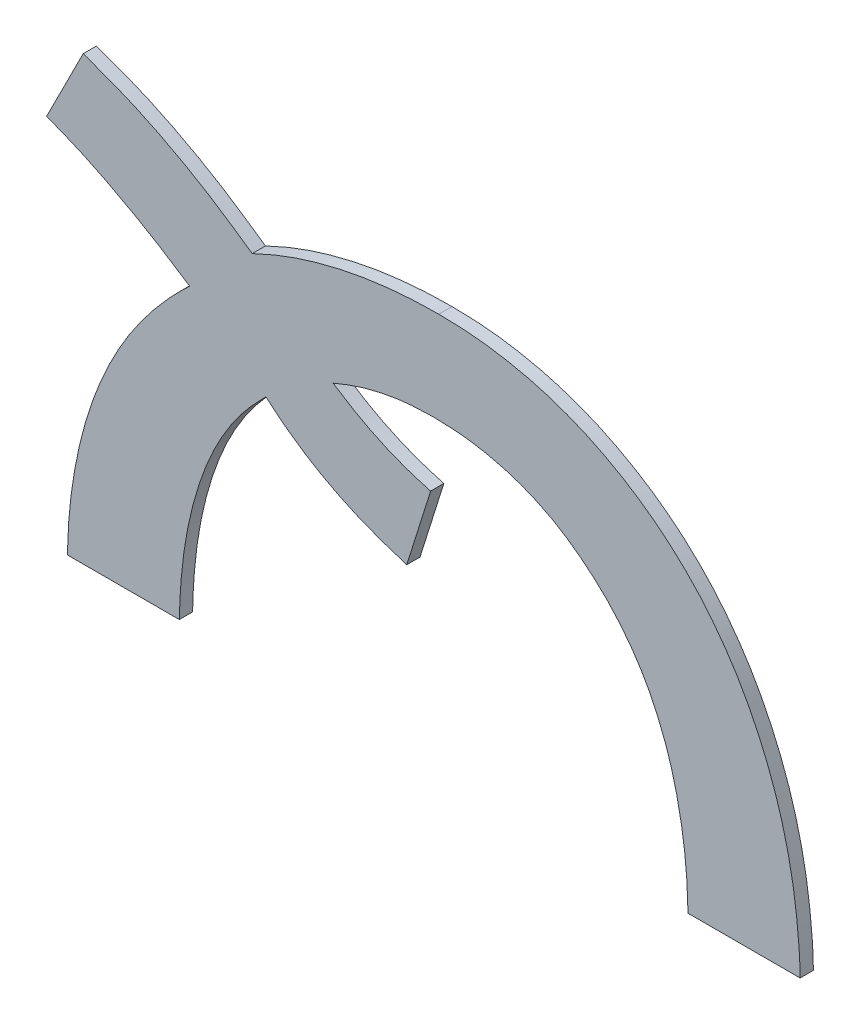
ISO-10303-21;
HEADER;
FILE_DESCRIPTION(('STEP AP214'),'2;1');
FILE_NAME('part.step','',(''),(''),'','','');
FILE_SCHEMA(('AUTOMOTIVE_DESIGN { 1 0 10303 214 1 1 1 1 }'));
ENDSEC;
DATA;
#1=APPLICATION_CONTEXT('core data for automotive mechanical design processes');
#2=APPLICATION_PROTOCOL_DEFINITION('international standard','automotive_design',2000,#1);
#3=PRODUCT_CONTEXT('',#1,'mechanical');
#4=PRODUCT('Part','Part','',(#3));
#5=PRODUCT_RELATED_PRODUCT_CATEGORY('part','',(#4));
#6=PRODUCT_DEFINITION_FORMATION('','',#4);
#7=PRODUCT_DEFINITION_CONTEXT('part definition',#1,'design');
#8=PRODUCT_DEFINITION('design','',#6,#7);
#9=PRODUCT_DEFINITION_SHAPE('','',#8);
#10=(LENGTH_UNIT() NAMED_UNIT(*) SI_UNIT(.MILLI.,.METRE.));
#11=(NAMED_UNIT(*) PLANE_ANGLE_UNIT() SI_UNIT($,.RADIAN.));
#12=(NAMED_UNIT(*) SI_UNIT($,.STERADIAN.) SOLID_ANGLE_UNIT());
#13=UNCERTAINTY_MEASURE_WITH_UNIT(LENGTH_MEASURE(1.E-05),#10,'distance_accuracy_value','');
#14=(GEOMETRIC_REPRESENTATION_CONTEXT(3) GLOBAL_UNCERTAINTY_ASSIGNED_CONTEXT((#13)) GLOBAL_UNIT_ASSIGNED_CONTEXT((#10,
#11,#12)) REPRESENTATION_CONTEXT('',''));
#15=CARTESIAN_POINT('',(0.,0.,0.));
#16=DIRECTION('',(0.,0.,1.));
#17=DIRECTION('',(1.,0.,0.));
#18=AXIS2_PLACEMENT_3D('',#15,#16,#17);
#19=CARTESIAN_POINT('',(-12.3982386079212,6.27826392564542,0.5));
#20=DIRECTION('',(0.,0.,1.));
#21=DIRECTION('',(1.,0.,0.));
#22=AXIS2_PLACEMENT_3D('',#19,#20,#21);
#23=PLANE('',#22);
#24=CARTESIAN_POINT('',(0.576923076923074,15.3846153846154,0.5));
#25=CARTESIAN_POINT('',(0.897619341624967,15.3787984604875,0.5));
#26=CARTESIAN_POINT('',(1.53228331754493,15.3672866575733,0.5));
#27=CARTESIAN_POINT('',(2.47464645125807,15.2766283145306,0.5));
#28=CARTESIAN_POINT('',(3.39276241348074,15.1169792641043,0.5));
#29=CARTESIAN_POINT('',(4.29266032368816,14.9113478929094,0.5));
#30=CARTESIAN_POINT('',(5.16350841743705,14.6295595206929,0.5));
#31=CARTESIAN_POINT('',(6.01619006759134,14.3024569764994,0.5));
#32=CARTESIAN_POINT('',(6.84083114128619,13.9005862613539,0.5));
#33=CARTESIAN_POINT('',(7.64330936840855,13.4474074551456,0.5));
#34=CARTESIAN_POINT('',(8.41087821578076,12.9377932302964,0.5));
#35=CARTESIAN_POINT('',(9.13697353297306,12.3764459160536,0.5));
#36=CARTESIAN_POINT('',(9.81513106542851,11.7610085525797,0.5));
#37=CARTESIAN_POINT('',(10.4546382387203,11.1026201644002,0.5));
#38=CARTESIAN_POINT('',(11.0378888073002,10.3870957987931,0.5));
#39=CARTESIAN_POINT('',(11.5817063578826,9.62748963764886,0.5));
#40=CARTESIAN_POINT('',(12.0801177436875,8.81640537319767,0.5));
#41=CARTESIAN_POINT('',(12.5279999518953,7.95734522134682,0.5));
#42=CARTESIAN_POINT('',(12.9314396675392,7.06317020682446,0.5));
#43=CARTESIAN_POINT('',(13.2788140744158,6.13726011642643,0.5));
#44=CARTESIAN_POINT('',(13.5748874813459,5.18438418310955,0.5));
#45=CARTESIAN_POINT('',(13.8148333799239,4.20289553652234,0.5));
#46=CARTESIAN_POINT('',(14.0012038848267,3.19352575648622,0.5));
#47=CARTESIAN_POINT('',(14.130269006995,2.15597744458412,0.5));
#48=CARTESIAN_POINT('',(14.2205910164886,1.09334364334748,0.5));
#49=CARTESIAN_POINT('',(14.2273545422517,0.374792695103607,0.5));
#50=CARTESIAN_POINT('',(14.2307692307692,0.0120192307692304,0.5));
#51=B_SPLINE_CURVE_WITH_KNOTS('',3,(#24,#25,#26,#27,#28,#29,#30,#31,#32,#33,#34,#35,#36,#37,#38,
#39,#40,#41,#42,#43,#44,#45,#46,#47,#48,#49,#50),.UNSPECIFIED.,.F.,.F.,(4,1,1,1,1,1,1,1,1,1,1,1,
1,1,1,1,1,1,1,1,1,1,1,1,4),(0.,0.0417232689446733,0.0825711387110152,0.123021249513785,
0.162914135863894,0.202563611799557,0.24201125109967,0.281647017573563,0.32179960719226,
0.36184800870174,0.401418590368862,0.44109547101707,0.480911651680141,0.520725272941832,
0.561083748663584,0.60238891117765,0.6444761293121,0.687057601964957,0.729949051165575,
0.773065612414117,0.816810983522217,0.861338270957762,0.906534131619744,0.95281206301071,1.),.UNSPECIFIED.);
#52=CARTESIAN_POINT('',(0.576923076923074,15.3846153846154,0.5));
#53=VERTEX_POINT('',#52);
#54=CARTESIAN_POINT('',(14.2249316228687,0.5,0.5));
#55=VERTEX_POINT('',#54);
#56=EDGE_CURVE('E277',#53,#55,#51,.T.);
#57=ORIENTED_EDGE('',*,*,#56,.T.);
#58=DIRECTION('',(-1.,0.,0.));
#59=VECTOR('',#58,1.);
#60=CARTESIAN_POINT('',(-12.3982386079212,0.5,0.5));
#61=LINE('',#60,#59);
#62=CARTESIAN_POINT('',(9.99087380576317,0.5,0.5));
#63=VERTEX_POINT('',#62);
#64=EDGE_CURVE('E158',#55,#63,#61,.T.);
#65=ORIENTED_EDGE('',*,*,#64,.T.);
#66=CARTESIAN_POINT('',(10.,0.,0.5));
#67=CARTESIAN_POINT('',(9.9922792013081,0.467014057872968,0.5));
#68=CARTESIAN_POINT('',(9.97730448483657,1.37280157856109,0.5));
#69=CARTESIAN_POINT('',(9.85158071000492,2.69117608092411,0.5));
#70=CARTESIAN_POINT('',(9.63384343863532,3.92365530492593,0.5));
#71=CARTESIAN_POINT('',(9.34554905740699,5.07886684818043,0.5));
#72=CARTESIAN_POINT('',(8.95708699602344,6.14518844517494,0.5));
#73=CARTESIAN_POINT('',(8.49707536101354,7.13419261451192,0.5));
#74=CARTESIAN_POINT('',(7.94070220651536,8.03447107253892,0.500000000000001));
#75=CARTESIAN_POINT('',(7.30253401757682,8.84588556284268,0.5));
#76=CARTESIAN_POINT('',(6.59977786799587,9.56752298930225,0.5));
#77=CARTESIAN_POINT('',(5.84390717476958,10.194167751821,0.5));
#78=CARTESIAN_POINT('',(5.04937942384997,10.7364560293608,0.5));
#79=CARTESIAN_POINT('',(4.19881378747112,11.1719859807892,0.5));
#80=CARTESIAN_POINT('',(3.30086595430551,11.508275036905,0.5));
#81=CARTESIAN_POINT('',(2.35785953735712,11.7481374579581,0.5));
#82=CARTESIAN_POINT('',(1.36893698318586,11.8972655077949,0.5));
#83=CARTESIAN_POINT('',(0.693646802548687,11.9143475825137,0.5));
#84=CARTESIAN_POINT('',(0.34855769230769,11.9230769230769,0.5));
#85=B_SPLINE_CURVE_WITH_KNOTS('',3,(#66,#67,#68,#69,#70,#71,#72,#73,#74,#75,#76,#77,#78,#79,#80,
#81,#82,#83,#84),.UNSPECIFIED.,.F.,.F.,(4,1,1,1,1,1,1,1,1,1,1,1,1,1,1,1,4),(0.,
0.0810326621300396,0.157165234939228,0.229518397457671,0.298064470604454,0.363492405304042,
0.426159072652892,0.487032782037051,0.546699482760247,0.604960279723965,0.661486145143537,
0.716828091605148,0.771554126409179,0.826887338001704,0.882870803772946,0.940144235369899,1.),.UNSPECIFIED.);
#86=CARTESIAN_POINT('',(0.34855769230769,11.9230769230769,0.5));
#87=VERTEX_POINT('',#86);
#88=EDGE_CURVE('E555',#63,#87,#85,.T.);
#89=ORIENTED_EDGE('',*,*,#88,.T.);
#90=CARTESIAN_POINT('',(0.34855769230769,11.9230769230769,0.5));
#91=CARTESIAN_POINT('',(0.0193452359396035,11.9148843529333,0.5));
#92=CARTESIAN_POINT('',(-0.630599722610887,11.8987102393498,0.5));
#93=CARTESIAN_POINT('',(-1.59000664115034,11.7376437849044,0.5));
#94=CARTESIAN_POINT('',(-2.52369149856271,11.5000166192497,0.5));
#95=CARTESIAN_POINT('',(-3.11736668310616,11.2570144009192,0.5));
#96=CARTESIAN_POINT('',(-3.41346153846154,11.1358173076923,0.5));
#97=B_SPLINE_CURVE_WITH_KNOTS('',3,(#90,#91,#92,#93,#94,#95,#96),.UNSPECIFIED.,.F.,.F.,(4,1,1,1,
4),(0.,0.254952441716652,0.503337741202005,0.752290236297546,1.),.UNSPECIFIED.);
#98=CARTESIAN_POINT('',(-3.41346153846154,11.1358173076923,0.5));
#99=VERTEX_POINT('',#98);
#100=EDGE_CURVE('E377',#87,#99,#97,.T.);
#101=ORIENTED_EDGE('',*,*,#100,.T.);
#102=CARTESIAN_POINT('',(-3.41346153846154,11.1358173076923,0.5));
#103=CARTESIAN_POINT('',(-3.12193255975835,10.9485047593671,0.5));
#104=CARTESIAN_POINT('',(-2.54231838442725,10.5760923538847,0.5));
#105=CARTESIAN_POINT('',(-1.62869956752675,10.1109285131715,0.5));
#106=CARTESIAN_POINT('',(-0.692808404415679,9.72462489088026,0.5));
#107=CARTESIAN_POINT('',(-0.0500473457026729,9.53944559915724,0.5));
#108=CARTESIAN_POINT('',(0.270432692307688,9.44711538461538,0.5));
#109=B_SPLINE_CURVE_WITH_KNOTS('',3,(#102,#103,#104,#105,#106,#107,#108),.UNSPECIFIED.,.F.,.F.,
(4,1,1,1,4),(0.,0.255212241850166,0.507409705039965,0.754394958573845,1.),.UNSPECIFIED.);
#110=CARTESIAN_POINT('',(0.270432692307688,9.44711538461538,0.5));
#111=VERTEX_POINT('',#110);
#112=EDGE_CURVE('E320',#99,#111,#109,.T.);
#113=ORIENTED_EDGE('',*,*,#112,.T.);
#114=DIRECTION('',(-0.300555941545493,-0.953764187837697,0.));
#115=VECTOR('',#114,1.);
#116=CARTESIAN_POINT('',(0.270432692307688,9.44711538461538,0.5));
#117=LINE('',#116,#115);
#118=CARTESIAN_POINT('',(-0.63100961538462,6.58653846153846,0.5));
#119=VERTEX_POINT('',#118);
#120=EDGE_CURVE('E306',#111,#119,#117,.T.);
#121=ORIENTED_EDGE('',*,*,#120,.T.);
#122=CARTESIAN_POINT('',(-0.63100961538462,6.58653846153846,0.5));
#123=CARTESIAN_POINT('',(-0.894319671134255,6.66803744267736,0.5));
#124=CARTESIAN_POINT('',(-1.41502985426516,6.82920618069991,0.5));
#125=CARTESIAN_POINT('',(-2.16813237873717,7.11271262365866,0.5));
#126=CARTESIAN_POINT('',(-2.89054022736661,7.41845518055138,0.5));
#127=CARTESIAN_POINT('',(-3.57092248636074,7.76113766295311,0.5));
#128=CARTESIAN_POINT('',(-4.22144770913973,8.12832644716513,0.5));
#129=CARTESIAN_POINT('',(-4.83039467529682,8.53225031230209,0.5));
#130=CARTESIAN_POINT('',(-5.41253203412093,8.95640226796856,0.5));
#131=CARTESIAN_POINT('',(-5.77133339907765,9.26822255770492,0.5));
#132=CARTESIAN_POINT('',(-5.94951923076923,9.42307692307692,0.5));
#133=B_SPLINE_CURVE_WITH_KNOTS('',3,(#122,#123,#124,#125,#126,#127,#128,#129,#130,#131,#132),
.UNSPECIFIED.,.F.,.F.,(4,1,1,1,1,1,1,1,4),(0.,0.136020898301321,0.268988841548293,
0.397000820882357,0.52302316466143,0.64480443078414,0.765468728430669,0.883528454003217,1.),.UNSPECIFIED.);
#134=CARTESIAN_POINT('',(-5.94951923076923,9.42307692307692,0.5));
#135=VERTEX_POINT('',#134);
#136=EDGE_CURVE('E301',#119,#135,#133,.T.);
#137=ORIENTED_EDGE('',*,*,#136,.T.);
#138=CARTESIAN_POINT('',(-5.94951923076923,9.42307692307692,0.5));
#139=CARTESIAN_POINT('',(-6.21339353106539,9.15102080343158,0.5));
#140=CARTESIAN_POINT('',(-6.74350021905969,8.60447736069422,0.5));
#141=CARTESIAN_POINT('',(-7.41029581302277,7.65841943132263,0.5));
#142=CARTESIAN_POINT('',(-7.97857306160017,6.62075798482048,0.5));
#143=CARTESIAN_POINT('',(-8.43343144317379,5.47860993740602,0.5));
#144=CARTESIAN_POINT('',(-8.79336837355103,4.24314577309855,0.5));
#145=CARTESIAN_POINT('',(-9.050810047283,2.90759580353337,0.5));
#146=CARTESIAN_POINT('',(-9.19861625487089,1.47369380087417,0.5));
#147=CARTESIAN_POINT('',(-9.21983868962944,0.485122001942624,0.5));
#148=CARTESIAN_POINT('',(-9.23076923076923,-0.0240384615384625,0.5));
#149=B_SPLINE_CURVE_WITH_KNOTS('',3,(#138,#139,#140,#141,#142,#143,#144,#145,#146,#147,#148),
.UNSPECIFIED.,.F.,.F.,(4,1,1,1,1,1,1,1,4),(0.,0.110462276308717,0.221911688165935,
0.336496788692268,0.455039818437065,0.579907747375789,0.71152433155377,0.851421611249838,1.),.UNSPECIFIED.);
#150=CARTESIAN_POINT('',(-9.21865830504153,0.499999999999652,0.5));
#151=VERTEX_POINT('',#150);
#152=EDGE_CURVE('E159',#135,#151,#149,.T.);
#153=ORIENTED_EDGE('',*,*,#152,.T.);
#154=CARTESIAN_POINT('',(-13.4480510897707,0.5,0.5));
#155=VERTEX_POINT('',#154);
#156=EDGE_CURVE('E76',#151,#155,#61,.T.);
#157=ORIENTED_EDGE('',*,*,#156,.T.);
#158=CARTESIAN_POINT('',(-13.4615384615385,-0.0661057692307697,0.5));
#159=CARTESIAN_POINT('',(-13.448447909796,0.529543360709466,0.5));
#160=CARTESIAN_POINT('',(-13.4228809732129,1.69289566476289,0.5));
#161=CARTESIAN_POINT('',(-13.2011750676567,3.39095602761635,0.5));
#162=CARTESIAN_POINT('',(-12.8438670998185,4.99791100235376,0.5));
#163=CARTESIAN_POINT('',(-12.4185715031614,6.26893732044281,0.5));
#164=CARTESIAN_POINT('',(-12.0103870575625,7.23531832842407,0.5));
#165=CARTESIAN_POINT('',(-11.6636298213357,7.92963536124989,0.5));
#166=CARTESIAN_POINT('',(-11.2876531477885,8.60481515554408,0.5));
#167=CARTESIAN_POINT('',(-10.8658731813786,9.25014548547508,0.5));
#168=CARTESIAN_POINT('',(-10.4128898755363,9.87593479592107,0.5));
#169=CARTESIAN_POINT('',(-9.91931982103668,10.4722777353817,0.5));
#170=CARTESIAN_POINT('',(-9.39779409454394,11.0558551419238,0.5));
#171=CARTESIAN_POINT('',(-9.01896871610589,11.4167479847997,0.5));
#172=CARTESIAN_POINT('',(-8.828125,11.5985576923077,0.5));
#173=B_SPLINE_CURVE_WITH_KNOTS('',3,(#158,#159,#160,#161,#162,#163,#164,#165,#166,#167,#168,
#169,#170,#171,#172),.UNSPECIFIED.,.F.,.F.,(4,1,1,1,1,1,1,1,1,1,1,1,4),(0.,0.138145050648068,
0.269808776487479,0.396539726104905,0.519552566820215,0.580151072298964,0.63980296260712,
0.699525420126483,0.759340032227184,0.818555811725106,0.878658619240928,0.938870938063966,1.),.UNSPECIFIED.);
#174=CARTESIAN_POINT('',(-8.828125,11.5985576923077,0.5));
#175=VERTEX_POINT('',#174);
#176=EDGE_CURVE('E157',#155,#175,#173,.T.);
#177=ORIENTED_EDGE('',*,*,#176,.T.);
#178=CARTESIAN_POINT('',(-8.828125,11.5985576923077,0.5));
#179=CARTESIAN_POINT('',(-9.30339084511521,11.9088027049189,0.5));
#180=CARTESIAN_POINT('',(-10.2196826900888,12.506941573767,0.5));
#181=CARTESIAN_POINT('',(-11.603756135955,13.2805049096162,0.5));
#182=CARTESIAN_POINT('',(-12.9223506421253,13.9425410548634,0.5));
#183=CARTESIAN_POINT('',(-13.8053507859795,14.287114038554,0.5));
#184=CARTESIAN_POINT('',(-14.2307692307692,14.453125,0.5));
#185=B_SPLINE_CURVE_WITH_KNOTS('',3,(#178,#179,#180,#181,#182,#183,#184),.UNSPECIFIED.,.F.,.F.,
(4,1,1,1,4),(0.,0.277956960753433,0.535888911458132,0.776397072105441,1.),.UNSPECIFIED.);
#186=CARTESIAN_POINT('',(-14.2307692307692,14.453125,0.5));
#187=VERTEX_POINT('',#186);
#188=EDGE_CURVE('E163',#175,#187,#185,.T.);
#189=ORIENTED_EDGE('',*,*,#188,.T.);
#190=DIRECTION('',(0.450343677813314,0.892855291664656,0.));
#191=VECTOR('',#190,1.);
#192=CARTESIAN_POINT('',(-14.2307692307692,14.453125,0.5));
#193=LINE('',#192,#191);
#194=CARTESIAN_POINT('',(-12.8485576923077,17.1935096153846,0.5));
#195=VERTEX_POINT('',#194);
#196=EDGE_CURVE('E167',#187,#195,#193,.T.);
#197=ORIENTED_EDGE('',*,*,#196,.T.);
#198=CARTESIAN_POINT('',(-12.8485576923077,17.1935096153846,0.5));
#199=CARTESIAN_POINT('',(-12.3120993784537,17.0000066791123,0.5));
#200=CARTESIAN_POINT('',(-11.2206986142658,16.6063334950711,0.5));
#201=CARTESIAN_POINT('',(-9.62170676964987,15.8375651898538,0.5));
#202=CARTESIAN_POINT('',(-8.02073337734736,14.9244452314316,0.5));
#203=CARTESIAN_POINT('',(-6.99201361843773,14.2108137520125,0.5));
#204=CARTESIAN_POINT('',(-6.46634615384616,13.8461538461538,0.5));
#205=B_SPLINE_CURVE_WITH_KNOTS('',3,(#198,#199,#200,#201,#202,#203,#204),.UNSPECIFIED.,.F.,.F.,
(4,1,1,1,4),(0.,0.236400155123091,0.48094568262331,0.734767447949169,1.),.UNSPECIFIED.);
#206=CARTESIAN_POINT('',(-6.46634615384616,13.8461538461538,0.5));
#207=VERTEX_POINT('',#206);
#208=EDGE_CURVE('E196',#195,#207,#205,.T.);
#209=ORIENTED_EDGE('',*,*,#208,.T.);
#210=CARTESIAN_POINT('',(-6.46634615384616,13.8461538461538,0.5));
#211=CARTESIAN_POINT('',(-6.19939511471727,13.9698084917005,0.5));
#212=CARTESIAN_POINT('',(-5.66430680122598,14.2176672599483,0.5));
#213=CARTESIAN_POINT('',(-4.83209778876263,14.5279171170542,0.5));
#214=CARTESIAN_POINT('',(-3.97926204408,14.7923295930873,0.5));
#215=CARTESIAN_POINT('',(-3.10637542461355,15.0087753843001,0.5));
#216=CARTESIAN_POINT('',(-2.21552557147388,15.1772174489932,0.5));
#217=CARTESIAN_POINT('',(-1.30470450159003,15.2970048763891,0.5));
#218=CARTESIAN_POINT('',(-0.371834038275706,15.3711748992426,0.5));
#219=CARTESIAN_POINT('',(0.258275605184074,15.380101292848,0.5));
#220=CARTESIAN_POINT('',(0.576923076923074,15.3846153846154,0.5));
#221=B_SPLINE_CURVE_WITH_KNOTS('',3,(#210,#211,#212,#213,#214,#215,#216,#217,#218,#219,#220),
.UNSPECIFIED.,.F.,.F.,(4,1,1,1,1,1,1,1,4),(0.,0.12135731050129,0.243253889619143,
0.36613298132967,0.489624940142382,0.614127982050897,0.740030729593687,0.868533117046174,1.),.UNSPECIFIED.);
#222=EDGE_CURVE('E201',#207,#53,#221,.T.);
#223=ORIENTED_EDGE('',*,*,#222,.T.);
#224=EDGE_LOOP('',(#57,#65,#89,#101,#113,#121,#137,#153,#157,#177,#189,#197,#209,#223));
#225=FACE_BOUND('',#224,.T.);
#226=ADVANCED_FACE('F39',(#225),#23,.F.);
#227=CARTESIAN_POINT('',(-12.3982386079212,6.27826392564542,1.));
#228=DIRECTION('',(0.,0.,1.));
#229=DIRECTION('',(1.,0.,0.));
#230=AXIS2_PLACEMENT_3D('',#227,#228,#229);
#231=PLANE('',#230);
#232=CARTESIAN_POINT('',(-13.4615384615385,-0.0661057692307697,1.));
#233=CARTESIAN_POINT('',(-13.448447909796,0.529543360709466,1.));
#234=CARTESIAN_POINT('',(-13.4228809732129,1.69289566476289,1.));
#235=CARTESIAN_POINT('',(-13.2011750676567,3.39095602761635,1.));
#236=CARTESIAN_POINT('',(-12.8438670998185,4.99791100235376,1.));
#237=CARTESIAN_POINT('',(-12.4185715031614,6.26893732044281,1.));
#238=CARTESIAN_POINT('',(-12.0103870575625,7.23531832842407,1.));
#239=CARTESIAN_POINT('',(-11.6636298213357,7.92963536124989,1.));
#240=CARTESIAN_POINT('',(-11.2876531477885,8.60481515554408,1.));
#241=CARTESIAN_POINT('',(-10.8658731813786,9.25014548547508,1.));
#242=CARTESIAN_POINT('',(-10.4128898755363,9.87593479592107,1.));
#243=CARTESIAN_POINT('',(-9.91931982103668,10.4722777353817,1.));
#244=CARTESIAN_POINT('',(-9.39779409454394,11.0558551419238,1.));
#245=CARTESIAN_POINT('',(-9.01896871610589,11.4167479847997,1.));
#246=CARTESIAN_POINT('',(-8.828125,11.5985576923077,1.));
#247=B_SPLINE_CURVE_WITH_KNOTS('',3,(#232,#233,#234,#235,#236,#237,#238,#239,#240,#241,#242,
#243,#244,#245,#246),.UNSPECIFIED.,.F.,.F.,(4,1,1,1,1,1,1,1,1,1,1,1,4),(0.,0.138145050648068,
0.269808776487479,0.396539726104905,0.519552566820215,0.580151072298964,0.63980296260712,
0.699525420126483,0.759340032227184,0.818555811725106,0.878658619240928,0.938870938063966,1.),.UNSPECIFIED.);
#248=CARTESIAN_POINT('',(-13.4480510897707,0.5,1.));
#249=VERTEX_POINT('',#248);
#250=CARTESIAN_POINT('',(-8.828125,11.5985576923077,1.));
#251=VERTEX_POINT('',#250);
#252=EDGE_CURVE('E152',#249,#251,#247,.T.);
#253=ORIENTED_EDGE('',*,*,#252,.F.);
#254=DIRECTION('',(1.,0.,0.));
#255=VECTOR('',#254,1.);
#256=CARTESIAN_POINT('',(-17.,0.5,1.));
#257=LINE('',#256,#255);
#258=CARTESIAN_POINT('',(-9.21865830504152,0.5,1.));
#259=VERTEX_POINT('',#258);
#260=EDGE_CURVE('E150',#249,#259,#257,.T.);
#261=ORIENTED_EDGE('',*,*,#260,.T.);
#262=CARTESIAN_POINT('',(-5.94951923076923,9.42307692307692,1.));
#263=CARTESIAN_POINT('',(-6.21339353106539,9.15102080343158,1.));
#264=CARTESIAN_POINT('',(-6.74350021905969,8.60447736069422,1.));
#265=CARTESIAN_POINT('',(-7.41029581302277,7.65841943132263,1.));
#266=CARTESIAN_POINT('',(-7.97857306160017,6.62075798482048,1.));
#267=CARTESIAN_POINT('',(-8.43343144317379,5.47860993740602,1.));
#268=CARTESIAN_POINT('',(-8.79336837355103,4.24314577309855,1.));
#269=CARTESIAN_POINT('',(-9.050810047283,2.90759580353337,1.));
#270=CARTESIAN_POINT('',(-9.19861625487089,1.47369380087417,1.));
#271=CARTESIAN_POINT('',(-9.21983868962944,0.485122001942624,1.));
#272=CARTESIAN_POINT('',(-9.23076923076923,-0.0240384615384625,1.));
#273=B_SPLINE_CURVE_WITH_KNOTS('',3,(#262,#263,#264,#265,#266,#267,#268,#269,#270,#271,#272),
.UNSPECIFIED.,.F.,.F.,(4,1,1,1,1,1,1,1,4),(0.,0.110462276308717,0.221911688165935,
0.336496788692268,0.455039818437065,0.579907747375789,0.71152433155377,0.851421611249838,1.),.UNSPECIFIED.);
#274=CARTESIAN_POINT('',(-5.94951923076923,9.42307692307692,1.));
#275=VERTEX_POINT('',#274);
#276=EDGE_CURVE('E325',#275,#259,#273,.T.);
#277=ORIENTED_EDGE('',*,*,#276,.F.);
#278=CARTESIAN_POINT('',(-0.63100961538462,6.58653846153846,1.));
#279=CARTESIAN_POINT('',(-0.894319671134255,6.66803744267736,1.));
#280=CARTESIAN_POINT('',(-1.41502985426516,6.82920618069991,1.));
#281=CARTESIAN_POINT('',(-2.16813237873717,7.11271262365866,1.));
#282=CARTESIAN_POINT('',(-2.89054022736661,7.41845518055138,1.));
#283=CARTESIAN_POINT('',(-3.57092248636074,7.76113766295311,1.));
#284=CARTESIAN_POINT('',(-4.22144770913973,8.12832644716513,1.));
#285=CARTESIAN_POINT('',(-4.83039467529682,8.53225031230209,1.));
#286=CARTESIAN_POINT('',(-5.41253203412093,8.95640226796856,1.));
#287=CARTESIAN_POINT('',(-5.77133339907765,9.26822255770492,1.));
#288=CARTESIAN_POINT('',(-5.94951923076923,9.42307692307692,1.));
#289=B_SPLINE_CURVE_WITH_KNOTS('',3,(#278,#279,#280,#281,#282,#283,#284,#285,#286,#287,#288),
.UNSPECIFIED.,.F.,.F.,(4,1,1,1,1,1,1,1,4),(0.,0.136020898301321,0.268988841548293,
0.397000820882357,0.52302316466143,0.64480443078414,0.765468728430669,0.883528454003217,1.),.UNSPECIFIED.);
#290=CARTESIAN_POINT('',(-0.63100961538462,6.58653846153846,1.));
#291=VERTEX_POINT('',#290);
#292=EDGE_CURVE('E47',#291,#275,#289,.T.);
#293=ORIENTED_EDGE('',*,*,#292,.F.);
#294=DIRECTION('',(-0.300555941545493,-0.953764187837697,0.));
#295=VECTOR('',#294,1.);
#296=CARTESIAN_POINT('',(0.270432692307688,9.44711538461538,1.));
#297=LINE('',#296,#295);
#298=CARTESIAN_POINT('',(0.270432692307688,9.44711538461538,1.));
#299=VERTEX_POINT('',#298);
#300=EDGE_CURVE('E339',#299,#291,#297,.T.);
#301=ORIENTED_EDGE('',*,*,#300,.F.);
#302=CARTESIAN_POINT('',(-3.41346153846154,11.1358173076923,1.));
#303=CARTESIAN_POINT('',(-3.12193255975835,10.9485047593671,1.));
#304=CARTESIAN_POINT('',(-2.54231838442725,10.5760923538847,1.));
#305=CARTESIAN_POINT('',(-1.62869956752675,10.1109285131715,1.));
#306=CARTESIAN_POINT('',(-0.692808404415679,9.72462489088026,1.));
#307=CARTESIAN_POINT('',(-0.0500473457026729,9.53944559915724,1.));
#308=CARTESIAN_POINT('',(0.270432692307688,9.44711538461538,1.));
#309=B_SPLINE_CURVE_WITH_KNOTS('',3,(#302,#303,#304,#305,#306,#307,#308),.UNSPECIFIED.,.F.,.F.,
(4,1,1,1,4),(0.,0.255212241850166,0.507409705039965,0.754394958573845,1.),.UNSPECIFIED.);
#310=CARTESIAN_POINT('',(-3.41346153846154,11.1358173076923,1.));
#311=VERTEX_POINT('',#310);
#312=EDGE_CURVE('E337',#311,#299,#309,.T.);
#313=ORIENTED_EDGE('',*,*,#312,.F.);
#314=CARTESIAN_POINT('',(0.34855769230769,11.9230769230769,1.));
#315=CARTESIAN_POINT('',(0.0193452359396035,11.9148843529333,1.));
#316=CARTESIAN_POINT('',(-0.630599722610887,11.8987102393498,1.));
#317=CARTESIAN_POINT('',(-1.59000664115034,11.7376437849044,1.));
#318=CARTESIAN_POINT('',(-2.52369149856271,11.5000166192497,1.));
#319=CARTESIAN_POINT('',(-3.11736668310616,11.2570144009192,1.));
#320=CARTESIAN_POINT('',(-3.41346153846154,11.1358173076923,1.));
#321=B_SPLINE_CURVE_WITH_KNOTS('',3,(#314,#315,#316,#317,#318,#319,#320),.UNSPECIFIED.,.F.,.F.,
(4,1,1,1,4),(0.,0.254952441716652,0.503337741202005,0.752290236297546,1.),.UNSPECIFIED.);
#322=CARTESIAN_POINT('',(0.34855769230769,11.9230769230769,1.));
#323=VERTEX_POINT('',#322);
#324=EDGE_CURVE('E324',#323,#311,#321,.T.);
#325=ORIENTED_EDGE('',*,*,#324,.F.);
#326=CARTESIAN_POINT('',(10.,0.,1.));
#327=CARTESIAN_POINT('',(9.9922792013081,0.467014057872968,1.));
#328=CARTESIAN_POINT('',(9.97730448483657,1.37280157856109,1.));
#329=CARTESIAN_POINT('',(9.85158071000492,2.69117608092411,1.));
#330=CARTESIAN_POINT('',(9.63384343863532,3.92365530492593,1.));
#331=CARTESIAN_POINT('',(9.34554905740699,5.07886684818043,1.));
#332=CARTESIAN_POINT('',(8.95708699602344,6.14518844517494,1.));
#333=CARTESIAN_POINT('',(8.49707536101354,7.13419261451192,1.));
#334=CARTESIAN_POINT('',(7.94070220651536,8.03447107253892,1.));
#335=CARTESIAN_POINT('',(7.30253401757682,8.84588556284268,1.));
#336=CARTESIAN_POINT('',(6.59977786799587,9.56752298930225,1.));
#337=CARTESIAN_POINT('',(5.84390717476958,10.194167751821,1.));
#338=CARTESIAN_POINT('',(5.04937942384997,10.7364560293608,1.));
#339=CARTESIAN_POINT('',(4.19881378747112,11.1719859807892,1.));
#340=CARTESIAN_POINT('',(3.30086595430551,11.508275036905,1.));
#341=CARTESIAN_POINT('',(2.35785953735712,11.7481374579581,1.));
#342=CARTESIAN_POINT('',(1.36893698318586,11.8972655077949,1.));
#343=CARTESIAN_POINT('',(0.693646802548687,11.9143475825137,1.));
#344=CARTESIAN_POINT('',(0.34855769230769,11.9230769230769,1.));
#345=B_SPLINE_CURVE_WITH_KNOTS('',3,(#326,#327,#328,#329,#330,#331,#332,#333,#334,#335,#336,
#337,#338,#339,#340,#341,#342,#343,#344),.UNSPECIFIED.,.F.,.F.,(4,1,1,1,1,1,1,1,1,1,1,1,1,1,1,1,
4),(0.,0.0810326621300396,0.157165234939228,0.229518397457671,0.298064470604454,
0.363492405304042,0.426159072652892,0.487032782037051,0.546699482760247,0.604960279723965,
0.661486145143537,0.716828091605148,0.771554126409179,0.826887338001704,0.882870803772946,
0.940144235369899,1.),.UNSPECIFIED.);
#346=CARTESIAN_POINT('',(9.99087380576317,0.499999999999684,1.));
#347=VERTEX_POINT('',#346);
#348=EDGE_CURVE('E245',#347,#323,#345,.T.);
#349=ORIENTED_EDGE('',*,*,#348,.F.);
#350=CARTESIAN_POINT('',(14.2249316228687,0.5,1.));
#351=VERTEX_POINT('',#350);
#352=EDGE_CURVE('E43',#347,#351,#257,.T.);
#353=ORIENTED_EDGE('',*,*,#352,.T.);
#354=CARTESIAN_POINT('',(0.576923076923074,15.3846153846154,1.));
#355=CARTESIAN_POINT('',(0.897619341624967,15.3787984604875,1.));
#356=CARTESIAN_POINT('',(1.53228331754493,15.3672866575733,1.));
#357=CARTESIAN_POINT('',(2.47464645125807,15.2766283145306,1.));
#358=CARTESIAN_POINT('',(3.39276241348074,15.1169792641043,1.));
#359=CARTESIAN_POINT('',(4.29266032368816,14.9113478929094,1.));
#360=CARTESIAN_POINT('',(5.16350841743705,14.6295595206929,1.));
#361=CARTESIAN_POINT('',(6.01619006759134,14.3024569764994,1.));
#362=CARTESIAN_POINT('',(6.84083114128619,13.9005862613539,1.));
#363=CARTESIAN_POINT('',(7.64330936840855,13.4474074551456,1.));
#364=CARTESIAN_POINT('',(8.41087821578076,12.9377932302964,1.));
#365=CARTESIAN_POINT('',(9.13697353297306,12.3764459160536,1.));
#366=CARTESIAN_POINT('',(9.81513106542851,11.7610085525797,1.));
#367=CARTESIAN_POINT('',(10.4546382387203,11.1026201644002,1.));
#368=CARTESIAN_POINT('',(11.0378888073002,10.3870957987931,1.));
#369=CARTESIAN_POINT('',(11.5817063578826,9.62748963764886,1.));
#370=CARTESIAN_POINT('',(12.0801177436875,8.81640537319767,1.));
#371=CARTESIAN_POINT('',(12.5279999518953,7.95734522134682,1.));
#372=CARTESIAN_POINT('',(12.9314396675392,7.06317020682446,1.));
#373=CARTESIAN_POINT('',(13.2788140744158,6.13726011642643,1.));
#374=CARTESIAN_POINT('',(13.5748874813459,5.18438418310955,1.));
#375=CARTESIAN_POINT('',(13.8148333799239,4.20289553652234,1.));
#376=CARTESIAN_POINT('',(14.0012038848267,3.19352575648622,1.));
#377=CARTESIAN_POINT('',(14.130269006995,2.15597744458412,1.));
#378=CARTESIAN_POINT('',(14.2205910164886,1.09334364334748,1.));
#379=CARTESIAN_POINT('',(14.2273545422517,0.374792695103607,1.));
#380=CARTESIAN_POINT('',(14.2307692307692,0.0120192307692304,1.));
#381=B_SPLINE_CURVE_WITH_KNOTS('',3,(#354,#355,#356,#357,#358,#359,#360,#361,#362,#363,#364,
#365,#366,#367,#368,#369,#370,#371,#372,#373,#374,#375,#376,#377,#378,#379,#380),.UNSPECIFIED.,
.F.,.F.,(4,1,1,1,1,1,1,1,1,1,1,1,1,1,1,1,1,1,1,1,1,1,1,1,4),(0.,0.0417232689446733,
0.0825711387110152,0.123021249513785,0.162914135863894,0.202563611799557,0.24201125109967,
0.281647017573563,0.32179960719226,0.36184800870174,0.401418590368862,0.44109547101707,
0.480911651680141,0.520725272941832,0.561083748663584,0.60238891117765,0.6444761293121,
0.687057601964957,0.729949051165575,0.773065612414117,0.816810983522217,0.861338270957762,
0.906534131619744,0.95281206301071,1.),.UNSPECIFIED.);
#382=CARTESIAN_POINT('',(0.576923076923074,15.3846153846154,1.));
#383=VERTEX_POINT('',#382);
#384=EDGE_CURVE('E229',#383,#351,#381,.T.);
#385=ORIENTED_EDGE('',*,*,#384,.F.);
#386=CARTESIAN_POINT('',(-6.46634615384616,13.8461538461538,1.));
#387=CARTESIAN_POINT('',(-6.19939511471727,13.9698084917005,1.));
#388=CARTESIAN_POINT('',(-5.66430680122598,14.2176672599483,1.));
#389=CARTESIAN_POINT('',(-4.83209778876263,14.5279171170542,1.));
#390=CARTESIAN_POINT('',(-3.97926204408,14.7923295930873,1.));
#391=CARTESIAN_POINT('',(-3.10637542461355,15.0087753843001,1.));
#392=CARTESIAN_POINT('',(-2.21552557147388,15.1772174489932,1.));
#393=CARTESIAN_POINT('',(-1.30470450159003,15.2970048763891,1.));
#394=CARTESIAN_POINT('',(-0.371834038275706,15.3711748992426,1.));
#395=CARTESIAN_POINT('',(0.258275605184074,15.380101292848,1.));
#396=CARTESIAN_POINT('',(0.576923076923074,15.3846153846154,1.));
#397=B_SPLINE_CURVE_WITH_KNOTS('',3,(#386,#387,#388,#389,#390,#391,#392,#393,#394,#395,#396),
.UNSPECIFIED.,.F.,.F.,(4,1,1,1,1,1,1,1,4),(0.,0.12135731050129,0.243253889619143,
0.36613298132967,0.489624940142382,0.614127982050897,0.740030729593687,0.868533117046174,1.),.UNSPECIFIED.);
#398=CARTESIAN_POINT('',(-6.46634615384616,13.8461538461538,1.));
#399=VERTEX_POINT('',#398);
#400=EDGE_CURVE('E225',#399,#383,#397,.T.);
#401=ORIENTED_EDGE('',*,*,#400,.F.);
#402=CARTESIAN_POINT('',(-12.8485576923077,17.1935096153846,1.));
#403=CARTESIAN_POINT('',(-12.3120993784537,17.0000066791123,1.));
#404=CARTESIAN_POINT('',(-11.2206986142658,16.6063334950711,1.));
#405=CARTESIAN_POINT('',(-9.62170676964987,15.8375651898538,1.));
#406=CARTESIAN_POINT('',(-8.02073337734736,14.9244452314316,1.));
#407=CARTESIAN_POINT('',(-6.99201361843773,14.2108137520125,1.));
#408=CARTESIAN_POINT('',(-6.46634615384616,13.8461538461538,1.));
#409=B_SPLINE_CURVE_WITH_KNOTS('',3,(#402,#403,#404,#405,#406,#407,#408),.UNSPECIFIED.,.F.,.F.,
(4,1,1,1,4),(0.,0.236400155123091,0.48094568262331,0.734767447949169,1.),.UNSPECIFIED.);
#410=CARTESIAN_POINT('',(-12.8485576923077,17.1935096153846,1.));
#411=VERTEX_POINT('',#410);
#412=EDGE_CURVE('E223',#411,#399,#409,.T.);
#413=ORIENTED_EDGE('',*,*,#412,.F.);
#414=DIRECTION('',(0.450343677813314,0.892855291664656,0.));
#415=VECTOR('',#414,1.);
#416=CARTESIAN_POINT('',(-14.2307692307692,14.453125,1.));
#417=LINE('',#416,#415);
#418=CARTESIAN_POINT('',(-14.2307692307692,14.453125,1.));
#419=VERTEX_POINT('',#418);
#420=EDGE_CURVE('E217',#419,#411,#417,.T.);
#421=ORIENTED_EDGE('',*,*,#420,.F.);
#422=CARTESIAN_POINT('',(-8.828125,11.5985576923077,1.));
#423=CARTESIAN_POINT('',(-9.30339084511521,11.9088027049189,1.));
#424=CARTESIAN_POINT('',(-10.2196826900888,12.506941573767,1.));
#425=CARTESIAN_POINT('',(-11.603756135955,13.2805049096162,1.));
#426=CARTESIAN_POINT('',(-12.9223506421253,13.9425410548634,1.));
#427=CARTESIAN_POINT('',(-13.8053507859795,14.287114038554,1.));
#428=CARTESIAN_POINT('',(-14.2307692307692,14.453125,1.));
#429=B_SPLINE_CURVE_WITH_KNOTS('',3,(#422,#423,#424,#425,#426,#427,#428),.UNSPECIFIED.,.F.,.F.,
(4,1,1,1,4),(0.,0.277956960753433,0.535888911458132,0.776397072105441,1.),.UNSPECIFIED.);
#430=EDGE_CURVE('E267',#251,#419,#429,.T.);
#431=ORIENTED_EDGE('',*,*,#430,.F.);
#432=EDGE_LOOP('',(#253,#261,#277,#293,#301,#313,#325,#349,#353,#385,#401,#413,#421,#431));
#433=FACE_BOUND('',#432,.T.);
#434=ADVANCED_FACE('F41',(#433),#231,.T.);
#435=DIRECTION('',(0.,0.,1.));
#436=VECTOR('',#435,1.);
#437=SURFACE_OF_LINEAR_EXTRUSION('',#173,#436);
#438=ORIENTED_EDGE('',*,*,#176,.F.);
#439=DIRECTION('',(0.,0.,1.));
#440=VECTOR('',#439,1.);
#441=CARTESIAN_POINT('',(-13.4480510895033,0.5,0.5));
#442=LINE('',#441,#440);
#443=EDGE_CURVE('E144',#155,#249,#442,.T.);
#444=ORIENTED_EDGE('',*,*,#443,.T.);
#445=ORIENTED_EDGE('',*,*,#252,.T.);
#446=DIRECTION('',(0.,0.,1.));
#447=VECTOR('',#446,1.);
#448=CARTESIAN_POINT('',(-8.828125,11.5985576923077,0.5));
#449=LINE('',#448,#447);
#450=EDGE_CURVE('E161',#175,#251,#449,.T.);
#451=ORIENTED_EDGE('',*,*,#450,.F.);
#452=EDGE_LOOP('',(#438,#444,#445,#451));
#453=FACE_BOUND('',#452,.T.);
#454=ADVANCED_FACE('F164',(#453),#437,.F.);
#455=DIRECTION('',(0.,0.,1.));
#456=VECTOR('',#455,1.);
#457=SURFACE_OF_LINEAR_EXTRUSION('',#185,#456);
#458=ORIENTED_EDGE('',*,*,#430,.T.);
#459=DIRECTION('',(0.,0.,1.));
#460=VECTOR('',#459,1.);
#461=CARTESIAN_POINT('',(-14.2307692307692,14.453125,0.5));
#462=LINE('',#461,#460);
#463=EDGE_CURVE('E264',#187,#419,#462,.T.);
#464=ORIENTED_EDGE('',*,*,#463,.F.);
#465=ORIENTED_EDGE('',*,*,#188,.F.);
#466=ORIENTED_EDGE('',*,*,#450,.T.);
#467=EDGE_LOOP('',(#458,#464,#465,#466));
#468=FACE_BOUND('',#467,.T.);
#469=ADVANCED_FACE('F183',(#468),#457,.F.);
#470=CARTESIAN_POINT('',(-14.2307692307692,14.453125,0.5));
#471=DIRECTION('',(0.892855291664656,-0.450343677813314,0.));
#472=DIRECTION('',(0.450343677813314,0.892855291664656,0.));
#473=AXIS2_PLACEMENT_3D('',#470,#471,#472);
#474=PLANE('',#473);
#475=ORIENTED_EDGE('',*,*,#420,.T.);
#476=DIRECTION('',(0.,0.,1.));
#477=VECTOR('',#476,1.);
#478=CARTESIAN_POINT('',(-12.8485576923077,17.1935096153846,0.5));
#479=LINE('',#478,#477);
#480=EDGE_CURVE('E216',#195,#411,#479,.T.);
#481=ORIENTED_EDGE('',*,*,#480,.F.);
#482=ORIENTED_EDGE('',*,*,#196,.F.);
#483=ORIENTED_EDGE('',*,*,#463,.T.);
#484=EDGE_LOOP('',(#475,#481,#482,#483));
#485=FACE_BOUND('',#484,.T.);
#486=ADVANCED_FACE('F186',(#485),#474,.F.);
#487=DIRECTION('',(0.,0.,1.));
#488=VECTOR('',#487,1.);
#489=SURFACE_OF_LINEAR_EXTRUSION('',#205,#488);
#490=ORIENTED_EDGE('',*,*,#412,.T.);
#491=DIRECTION('',(0.,0.,1.));
#492=VECTOR('',#491,1.);
#493=CARTESIAN_POINT('',(-6.46634615384616,13.8461538461538,0.5));
#494=LINE('',#493,#492);
#495=EDGE_CURVE('E226',#207,#399,#494,.T.);
#496=ORIENTED_EDGE('',*,*,#495,.F.);
#497=ORIENTED_EDGE('',*,*,#208,.F.);
#498=ORIENTED_EDGE('',*,*,#480,.T.);
#499=EDGE_LOOP('',(#490,#496,#497,#498));
#500=FACE_BOUND('',#499,.T.);
#501=ADVANCED_FACE('F189',(#500),#489,.F.);
#502=DIRECTION('',(0.,0.,1.));
#503=VECTOR('',#502,1.);
#504=SURFACE_OF_LINEAR_EXTRUSION('',#221,#503);
#505=ORIENTED_EDGE('',*,*,#400,.T.);
#506=DIRECTION('',(0.,0.,1.));
#507=VECTOR('',#506,1.);
#508=CARTESIAN_POINT('',(0.576923076923074,15.3846153846154,0.5));
#509=LINE('',#508,#507);
#510=EDGE_CURVE('E233',#53,#383,#509,.T.);
#511=ORIENTED_EDGE('',*,*,#510,.F.);
#512=ORIENTED_EDGE('',*,*,#222,.F.);
#513=ORIENTED_EDGE('',*,*,#495,.T.);
#514=EDGE_LOOP('',(#505,#511,#512,#513));
#515=FACE_BOUND('',#514,.T.);
#516=ADVANCED_FACE('F193',(#515),#504,.F.);
#517=DIRECTION('',(0.,0.,1.));
#518=VECTOR('',#517,1.);
#519=SURFACE_OF_LINEAR_EXTRUSION('',#51,#518);
#520=ORIENTED_EDGE('',*,*,#384,.T.);
#521=DIRECTION('',(0.,0.,1.));
#522=VECTOR('',#521,1.);
#523=CARTESIAN_POINT('',(14.2249316227024,0.500000000000001,0.5));
#524=LINE('',#523,#522);
#525=EDGE_CURVE('E59',#351,#55,#524,.F.);
#526=ORIENTED_EDGE('',*,*,#525,.T.);
#527=ORIENTED_EDGE('',*,*,#56,.F.);
#528=ORIENTED_EDGE('',*,*,#510,.T.);
#529=EDGE_LOOP('',(#520,#526,#527,#528));
#530=FACE_BOUND('',#529,.T.);
#531=ADVANCED_FACE('F243',(#530),#519,.F.);
#532=CARTESIAN_POINT('',(0.270432692307688,9.44711538461538,0.5));
#533=DIRECTION('',(-0.953764187837697,0.300555941545493,0.));
#534=DIRECTION('',(-0.300555941545493,-0.953764187837697,0.));
#535=AXIS2_PLACEMENT_3D('',#532,#533,#534);
#536=PLANE('',#535);
#537=ORIENTED_EDGE('',*,*,#300,.T.);
#538=DIRECTION('',(0.,0.,1.));
#539=VECTOR('',#538,1.);
#540=CARTESIAN_POINT('',(-0.63100961538462,6.58653846153846,0.5));
#541=LINE('',#540,#539);
#542=EDGE_CURVE('E11',#119,#291,#541,.T.);
#543=ORIENTED_EDGE('',*,*,#542,.F.);
#544=ORIENTED_EDGE('',*,*,#120,.F.);
#545=DIRECTION('',(0.,0.,1.));
#546=VECTOR('',#545,1.);
#547=CARTESIAN_POINT('',(0.270432692307688,9.44711538461538,0.5));
#548=LINE('',#547,#546);
#549=EDGE_CURVE('E340',#111,#299,#548,.T.);
#550=ORIENTED_EDGE('',*,*,#549,.T.);
#551=EDGE_LOOP('',(#537,#543,#544,#550));
#552=FACE_BOUND('',#551,.T.);
#553=ADVANCED_FACE('F288',(#552),#536,.F.);
#554=DIRECTION('',(0.,0.,1.));
#555=VECTOR('',#554,1.);
#556=SURFACE_OF_LINEAR_EXTRUSION('',#109,#555);
#557=ORIENTED_EDGE('',*,*,#312,.T.);
#558=ORIENTED_EDGE('',*,*,#549,.F.);
#559=ORIENTED_EDGE('',*,*,#112,.F.);
#560=DIRECTION('',(0.,0.,1.));
#561=VECTOR('',#560,1.);
#562=CARTESIAN_POINT('',(-3.41346153846154,11.1358173076923,0.5));
#563=LINE('',#562,#561);
#564=EDGE_CURVE('E332',#99,#311,#563,.T.);
#565=ORIENTED_EDGE('',*,*,#564,.T.);
#566=EDGE_LOOP('',(#557,#558,#559,#565));
#567=FACE_BOUND('',#566,.T.);
#568=ADVANCED_FACE('F291',(#567),#556,.F.);
#569=DIRECTION('',(0.,0.,1.));
#570=VECTOR('',#569,1.);
#571=SURFACE_OF_LINEAR_EXTRUSION('',#97,#570);
#572=ORIENTED_EDGE('',*,*,#324,.T.);
#573=ORIENTED_EDGE('',*,*,#564,.F.);
#574=ORIENTED_EDGE('',*,*,#100,.F.);
#575=DIRECTION('',(0.,0.,1.));
#576=VECTOR('',#575,1.);
#577=CARTESIAN_POINT('',(0.34855769230769,11.9230769230769,0.5));
#578=LINE('',#577,#576);
#579=EDGE_CURVE('E317',#87,#323,#578,.T.);
#580=ORIENTED_EDGE('',*,*,#579,.T.);
#581=EDGE_LOOP('',(#572,#573,#574,#580));
#582=FACE_BOUND('',#581,.T.);
#583=ADVANCED_FACE('F389',(#582),#571,.F.);
#584=DIRECTION('',(0.,0.,1.));
#585=VECTOR('',#584,1.);
#586=SURFACE_OF_LINEAR_EXTRUSION('',#85,#585);
#587=ORIENTED_EDGE('',*,*,#88,.F.);
#588=DIRECTION('',(0.,0.,1.));
#589=VECTOR('',#588,1.);
#590=CARTESIAN_POINT('',(9.99087380576317,0.5,0.5));
#591=LINE('',#590,#589);
#592=EDGE_CURVE('E145',#63,#347,#591,.T.);
#593=ORIENTED_EDGE('',*,*,#592,.T.);
#594=ORIENTED_EDGE('',*,*,#348,.T.);
#595=ORIENTED_EDGE('',*,*,#579,.F.);
#596=EDGE_LOOP('',(#587,#593,#594,#595));
#597=FACE_BOUND('',#596,.T.);
#598=ADVANCED_FACE('F455',(#597),#586,.F.);
#599=DIRECTION('',(0.,0.,1.));
#600=VECTOR('',#599,1.);
#601=SURFACE_OF_LINEAR_EXTRUSION('',#149,#600);
#602=ORIENTED_EDGE('',*,*,#276,.T.);
#603=DIRECTION('',(0.,0.,1.));
#604=VECTOR('',#603,1.);
#605=CARTESIAN_POINT('',(-9.21865830504152,0.5,0.5));
#606=LINE('',#605,#604);
#607=EDGE_CURVE('E74',#259,#151,#606,.F.);
#608=ORIENTED_EDGE('',*,*,#607,.T.);
#609=ORIENTED_EDGE('',*,*,#152,.F.);
#610=DIRECTION('',(0.,0.,1.));
#611=VECTOR('',#610,1.);
#612=CARTESIAN_POINT('',(-5.94951923076923,9.42307692307692,0.5));
#613=LINE('',#612,#611);
#614=EDGE_CURVE('E331',#135,#275,#613,.T.);
#615=ORIENTED_EDGE('',*,*,#614,.T.);
#616=EDGE_LOOP('',(#602,#608,#609,#615));
#617=FACE_BOUND('',#616,.T.);
#618=ADVANCED_FACE('F296',(#617),#601,.F.);
#619=DIRECTION('',(0.,0.,1.));
#620=VECTOR('',#619,1.);
#621=SURFACE_OF_LINEAR_EXTRUSION('',#133,#620);
#622=ORIENTED_EDGE('',*,*,#292,.T.);
#623=ORIENTED_EDGE('',*,*,#614,.F.);
#624=ORIENTED_EDGE('',*,*,#136,.F.);
#625=ORIENTED_EDGE('',*,*,#542,.T.);
#626=EDGE_LOOP('',(#622,#623,#624,#625));
#627=FACE_BOUND('',#626,.T.);
#628=ADVANCED_FACE('F293',(#627),#621,.F.);
#629=CARTESIAN_POINT('',(-17.,0.5,1.));
#630=DIRECTION('',(0.,1.,0.));
#631=DIRECTION('',(0.,0.,1.));
#632=AXIS2_PLACEMENT_3D('',#629,#630,#631);
#633=PLANE('',#632);
#634=ORIENTED_EDGE('',*,*,#156,.F.);
#635=ORIENTED_EDGE('',*,*,#607,.F.);
#636=ORIENTED_EDGE('',*,*,#260,.F.);
#637=ORIENTED_EDGE('',*,*,#443,.F.);
#638=EDGE_LOOP('',(#634,#635,#636,#637));
#639=FACE_BOUND('',#638,.T.);
#640=ADVANCED_FACE('F147',(#639),#633,.F.);
#641=ORIENTED_EDGE('',*,*,#352,.F.);
#642=ORIENTED_EDGE('',*,*,#592,.F.);
#643=ORIENTED_EDGE('',*,*,#64,.F.);
#644=ORIENTED_EDGE('',*,*,#525,.F.);
#645=EDGE_LOOP('',(#641,#642,#643,#644));
#646=FACE_BOUND('',#645,.T.);
#647=ADVANCED_FACE('F386',(#646),#633,.F.);
#648=CLOSED_SHELL('',(#226,#434,#454,#469,#486,#501,#516,#531,#553,#568,#583,#598,#618,#628,
#640,#647));
#649=MANIFOLD_SOLID_BREP('B2',#648);
#650=ADVANCED_BREP_SHAPE_REPRESENTATION('',(#18,#649),#14);
#651=SHAPE_DEFINITION_REPRESENTATION(#9,#650);
ENDSEC;
END-ISO-10303-21;
